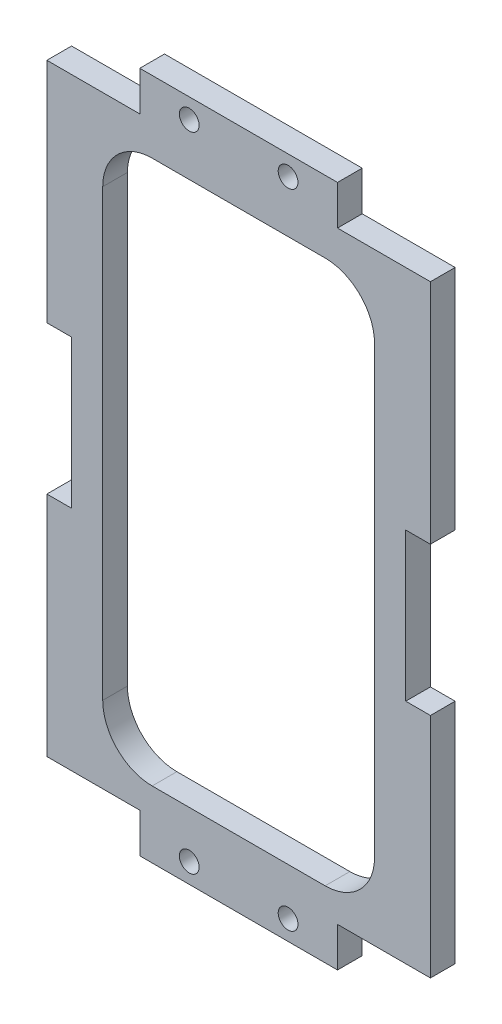
ISO-10303-21;
HEADER;
FILE_DESCRIPTION(('STEP AP214'),'2;1');
FILE_NAME('part.step','',(''),(''),'','','');
FILE_SCHEMA(('AUTOMOTIVE_DESIGN { 1 0 10303 214 1 1 1 1 }'));
ENDSEC;
DATA;
#1=APPLICATION_CONTEXT('core data for automotive mechanical design processes');
#2=APPLICATION_PROTOCOL_DEFINITION('international standard','automotive_design',2000,#1);
#3=PRODUCT_CONTEXT('',#1,'mechanical');
#4=PRODUCT('Part','Part','',(#3));
#5=PRODUCT_RELATED_PRODUCT_CATEGORY('part','',(#4));
#6=PRODUCT_DEFINITION_FORMATION('','',#4);
#7=PRODUCT_DEFINITION_CONTEXT('part definition',#1,'design');
#8=PRODUCT_DEFINITION('design','',#6,#7);
#9=PRODUCT_DEFINITION_SHAPE('','',#8);
#10=(LENGTH_UNIT() NAMED_UNIT(*) SI_UNIT(.MILLI.,.METRE.));
#11=(NAMED_UNIT(*) PLANE_ANGLE_UNIT() SI_UNIT($,.RADIAN.));
#12=(NAMED_UNIT(*) SI_UNIT($,.STERADIAN.) SOLID_ANGLE_UNIT());
#13=UNCERTAINTY_MEASURE_WITH_UNIT(LENGTH_MEASURE(1.E-05),#10,'distance_accuracy_value','');
#14=(GEOMETRIC_REPRESENTATION_CONTEXT(3) GLOBAL_UNCERTAINTY_ASSIGNED_CONTEXT((#13)) GLOBAL_UNIT_ASSIGNED_CONTEXT((#10,
#11,#12)) REPRESENTATION_CONTEXT('',''));
#15=CARTESIAN_POINT('',(0.,0.,0.));
#16=DIRECTION('',(0.,0.,1.));
#17=DIRECTION('',(1.,0.,0.));
#18=AXIS2_PLACEMENT_3D('',#15,#16,#17);
#19=CARTESIAN_POINT('',(0.,0.,5.));
#20=DIRECTION('',(1.,0.,0.));
#21=DIRECTION('',(0.,0.,-1.));
#22=AXIS2_PLACEMENT_3D('',#19,#20,#21);
#23=PLANE('',#22);
#24=DIRECTION('',(0.,0.,1.));
#25=VECTOR('',#24,1.);
#26=CARTESIAN_POINT('',(0.,7.5,0.));
#27=LINE('',#26,#25);
#28=CARTESIAN_POINT('',(0.,7.5,0.));
#29=VERTEX_POINT('',#28);
#30=CARTESIAN_POINT('',(0.,7.5,5.));
#31=VERTEX_POINT('',#30);
#32=EDGE_CURVE('E315',#29,#31,#27,.T.);
#33=ORIENTED_EDGE('',*,*,#32,.T.);
#34=DIRECTION('',(0.,-1.,0.));
#35=VECTOR('',#34,1.);
#36=CARTESIAN_POINT('',(0.,0.,5.));
#37=LINE('',#36,#35);
#38=CARTESIAN_POINT('',(0.,53.5,5.));
#39=VERTEX_POINT('',#38);
#40=EDGE_CURVE('E416',#39,#31,#37,.T.);
#41=ORIENTED_EDGE('',*,*,#40,.F.);
#42=DIRECTION('',(0.,0.,1.));
#43=VECTOR('',#42,1.);
#44=CARTESIAN_POINT('',(0.,53.5,0.));
#45=LINE('',#44,#43);
#46=CARTESIAN_POINT('',(0.,53.5,0.));
#47=VERTEX_POINT('',#46);
#48=EDGE_CURVE('E392',#47,#39,#45,.T.);
#49=ORIENTED_EDGE('',*,*,#48,.F.);
#50=DIRECTION('',(0.,-1.,0.));
#51=VECTOR('',#50,1.);
#52=CARTESIAN_POINT('',(0.,0.,0.));
#53=LINE('',#52,#51);
#54=EDGE_CURVE('E410',#47,#29,#53,.T.);
#55=ORIENTED_EDGE('',*,*,#54,.T.);
#56=EDGE_LOOP('',(#33,#41,#49,#55));
#57=FACE_BOUND('',#56,.T.);
#58=ADVANCED_FACE('F34',(#57),#23,.F.);
#59=DIRECTION('',(0.,0.,1.));
#60=VECTOR('',#59,1.);
#61=CARTESIAN_POINT('',(0.,83.5,0.));
#62=LINE('',#61,#60);
#63=CARTESIAN_POINT('',(0.,83.5,0.));
#64=VERTEX_POINT('',#63);
#65=CARTESIAN_POINT('',(0.,83.5,5.));
#66=VERTEX_POINT('',#65);
#67=EDGE_CURVE('E394',#64,#66,#62,.T.);
#68=ORIENTED_EDGE('',*,*,#67,.T.);
#69=CARTESIAN_POINT('',(0.,129.5,5.));
#70=VERTEX_POINT('',#69);
#71=EDGE_CURVE('E412',#70,#66,#37,.T.);
#72=ORIENTED_EDGE('',*,*,#71,.F.);
#73=DIRECTION('',(0.,0.,1.));
#74=VECTOR('',#73,1.);
#75=CARTESIAN_POINT('',(0.,129.5,0.));
#76=LINE('',#75,#74);
#77=CARTESIAN_POINT('',(0.,129.5,0.));
#78=VERTEX_POINT('',#77);
#79=EDGE_CURVE('E408',#78,#70,#76,.T.);
#80=ORIENTED_EDGE('',*,*,#79,.F.);
#81=EDGE_CURVE('E420',#78,#64,#53,.T.);
#82=ORIENTED_EDGE('',*,*,#81,.T.);
#83=EDGE_LOOP('',(#68,#72,#80,#82));
#84=FACE_BOUND('',#83,.T.);
#85=ADVANCED_FACE('F499',(#84),#23,.F.);
#86=CARTESIAN_POINT('',(0.,0.,5.));
#87=DIRECTION('',(0.,0.,-1.));
#88=DIRECTION('',(-1.,0.,0.));
#89=AXIS2_PLACEMENT_3D('',#86,#87,#88);
#90=PLANE('',#89);
#91=DIRECTION('',(0.,1.,0.));
#92=VECTOR('',#91,1.);
#93=CARTESIAN_POINT('',(11.3,0.,5.));
#94=LINE('',#93,#92);
#95=CARTESIAN_POINT('',(11.3,23.,5.));
#96=VERTEX_POINT('',#95);
#97=CARTESIAN_POINT('',(11.3,113.,5.));
#98=VERTEX_POINT('',#97);
#99=EDGE_CURVE('E276',#96,#98,#94,.T.);
#100=ORIENTED_EDGE('',*,*,#99,.T.);
#101=CARTESIAN_POINT('',(21.3,113.,5.));
#102=DIRECTION('',(0.,0.,-1.));
#103=DIRECTION('',(-1.,0.,0.));
#104=AXIS2_PLACEMENT_3D('',#101,#102,#103);
#105=CIRCLE('',#104,10.);
#106=CARTESIAN_POINT('',(21.3,123.,5.));
#107=VERTEX_POINT('',#106);
#108=EDGE_CURVE('E11',#98,#107,#105,.T.);
#109=ORIENTED_EDGE('',*,*,#108,.T.);
#110=DIRECTION('',(1.,0.,0.));
#111=VECTOR('',#110,1.);
#112=CARTESIAN_POINT('',(0.,123.,5.));
#113=LINE('',#112,#111);
#114=CARTESIAN_POINT('',(56.3,123.,5.));
#115=VERTEX_POINT('',#114);
#116=EDGE_CURVE('E278',#107,#115,#113,.T.);
#117=ORIENTED_EDGE('',*,*,#116,.T.);
#118=CARTESIAN_POINT('',(56.3,113.,5.));
#119=DIRECTION('',(0.,0.,-1.));
#120=DIRECTION('',(-1.,0.,0.));
#121=AXIS2_PLACEMENT_3D('',#118,#119,#120);
#122=CIRCLE('',#121,10.);
#123=CARTESIAN_POINT('',(66.3,113.,5.));
#124=VERTEX_POINT('',#123);
#125=EDGE_CURVE('E448',#115,#124,#122,.T.);
#126=ORIENTED_EDGE('',*,*,#125,.T.);
#127=DIRECTION('',(0.,-1.,0.));
#128=VECTOR('',#127,1.);
#129=CARTESIAN_POINT('',(66.3,0.,5.));
#130=LINE('',#129,#128);
#131=CARTESIAN_POINT('',(66.3,23.,5.));
#132=VERTEX_POINT('',#131);
#133=EDGE_CURVE('E281',#124,#132,#130,.T.);
#134=ORIENTED_EDGE('',*,*,#133,.T.);
#135=CARTESIAN_POINT('',(56.3,23.,5.));
#136=DIRECTION('',(0.,0.,-1.));
#137=DIRECTION('',(-1.,0.,0.));
#138=AXIS2_PLACEMENT_3D('',#135,#136,#137);
#139=CIRCLE('',#138,10.);
#140=CARTESIAN_POINT('',(56.3,13.,5.));
#141=VERTEX_POINT('',#140);
#142=EDGE_CURVE('E452',#132,#141,#139,.T.);
#143=ORIENTED_EDGE('',*,*,#142,.T.);
#144=DIRECTION('',(-1.,0.,0.));
#145=VECTOR('',#144,1.);
#146=CARTESIAN_POINT('',(0.,13.,5.));
#147=LINE('',#146,#145);
#148=CARTESIAN_POINT('',(21.3,13.,5.));
#149=VERTEX_POINT('',#148);
#150=EDGE_CURVE('E274',#141,#149,#147,.T.);
#151=ORIENTED_EDGE('',*,*,#150,.T.);
#152=CARTESIAN_POINT('',(21.3,23.,5.));
#153=DIRECTION('',(0.,0.,-1.));
#154=DIRECTION('',(-1.,0.,0.));
#155=AXIS2_PLACEMENT_3D('',#152,#153,#154);
#156=CIRCLE('',#155,10.);
#157=EDGE_CURVE('E56',#149,#96,#156,.T.);
#158=ORIENTED_EDGE('',*,*,#157,.T.);
#159=EDGE_LOOP('',(#100,#109,#117,#126,#134,#143,#151,#158));
#160=FACE_BOUND('',#159,.T.);
#161=CARTESIAN_POINT('',(48.8,133.5,5.));
#162=DIRECTION('',(0.,0.,1.));
#163=DIRECTION('',(1.,0.,0.));
#164=AXIS2_PLACEMENT_3D('',#161,#162,#163);
#165=CIRCLE('',#164,2.);
#166=CARTESIAN_POINT('',(50.8,133.5,5.));
#167=VERTEX_POINT('',#166);
#168=EDGE_CURVE('E289',#167,#167,#165,.T.);
#169=ORIENTED_EDGE('',*,*,#168,.F.);
#170=EDGE_LOOP('',(#169));
#171=FACE_BOUND('',#170,.T.);
#172=CARTESIAN_POINT('',(28.8,3.5,5.));
#173=DIRECTION('',(0.,0.,1.));
#174=DIRECTION('',(1.,0.,0.));
#175=AXIS2_PLACEMENT_3D('',#172,#173,#174);
#176=CIRCLE('',#175,2.);
#177=CARTESIAN_POINT('',(30.8,3.5,5.));
#178=VERTEX_POINT('',#177);
#179=EDGE_CURVE('E295',#178,#178,#176,.T.);
#180=ORIENTED_EDGE('',*,*,#179,.F.);
#181=EDGE_LOOP('',(#180));
#182=FACE_BOUND('',#181,.T.);
#183=CARTESIAN_POINT('',(48.8,3.5,5.));
#184=DIRECTION('',(0.,0.,1.));
#185=DIRECTION('',(1.,0.,0.));
#186=AXIS2_PLACEMENT_3D('',#183,#184,#185);
#187=CIRCLE('',#186,2.);
#188=CARTESIAN_POINT('',(50.8,3.5,5.));
#189=VERTEX_POINT('',#188);
#190=EDGE_CURVE('E284',#189,#189,#187,.T.);
#191=ORIENTED_EDGE('',*,*,#190,.F.);
#192=EDGE_LOOP('',(#191));
#193=FACE_BOUND('',#192,.T.);
#194=CARTESIAN_POINT('',(28.8,133.5,5.));
#195=DIRECTION('',(0.,0.,1.));
#196=DIRECTION('',(1.,0.,0.));
#197=AXIS2_PLACEMENT_3D('',#194,#195,#196);
#198=CIRCLE('',#197,2.);
#199=CARTESIAN_POINT('',(30.8,133.5,5.));
#200=VERTEX_POINT('',#199);
#201=EDGE_CURVE('E288',#200,#200,#198,.T.);
#202=ORIENTED_EDGE('',*,*,#201,.F.);
#203=EDGE_LOOP('',(#202));
#204=FACE_BOUND('',#203,.T.);
#205=DIRECTION('',(1.,0.,0.));
#206=VECTOR('',#205,1.);
#207=CARTESIAN_POINT('',(0.,7.5,5.));
#208=LINE('',#207,#206);
#209=CARTESIAN_POINT('',(18.8,7.5,5.));
#210=VERTEX_POINT('',#209);
#211=EDGE_CURVE('E232',#31,#210,#208,.T.);
#212=ORIENTED_EDGE('',*,*,#211,.T.);
#213=DIRECTION('',(0.,1.,0.));
#214=VECTOR('',#213,1.);
#215=CARTESIAN_POINT('',(18.8,0.,5.));
#216=LINE('',#215,#214);
#217=CARTESIAN_POINT('',(18.8,-0.5,5.));
#218=VERTEX_POINT('',#217);
#219=EDGE_CURVE('E310',#218,#210,#216,.T.);
#220=ORIENTED_EDGE('',*,*,#219,.F.);
#221=DIRECTION('',(1.,0.,0.));
#222=VECTOR('',#221,1.);
#223=CARTESIAN_POINT('',(18.8,-0.5,5.));
#224=LINE('',#223,#222);
#225=CARTESIAN_POINT('',(58.8,-0.5,5.));
#226=VERTEX_POINT('',#225);
#227=EDGE_CURVE('E240',#218,#226,#224,.T.);
#228=ORIENTED_EDGE('',*,*,#227,.T.);
#229=DIRECTION('',(0.,1.,0.));
#230=VECTOR('',#229,1.);
#231=CARTESIAN_POINT('',(58.8,0.,5.));
#232=LINE('',#231,#230);
#233=CARTESIAN_POINT('',(58.8,7.5,5.));
#234=VERTEX_POINT('',#233);
#235=EDGE_CURVE('E325',#226,#234,#232,.T.);
#236=ORIENTED_EDGE('',*,*,#235,.T.);
#237=DIRECTION('',(-1.,0.,0.));
#238=VECTOR('',#237,1.);
#239=CARTESIAN_POINT('',(0.,7.49999999999999,5.));
#240=LINE('',#239,#238);
#241=CARTESIAN_POINT('',(77.6,7.5,5.));
#242=VERTEX_POINT('',#241);
#243=EDGE_CURVE('E322',#242,#234,#240,.T.);
#244=ORIENTED_EDGE('',*,*,#243,.F.);
#245=DIRECTION('',(0.,1.,0.));
#246=VECTOR('',#245,1.);
#247=CARTESIAN_POINT('',(77.6,0.,5.));
#248=LINE('',#247,#246);
#249=CARTESIAN_POINT('',(77.6,53.5,5.));
#250=VERTEX_POINT('',#249);
#251=EDGE_CURVE('E419',#242,#250,#248,.T.);
#252=ORIENTED_EDGE('',*,*,#251,.T.);
#253=DIRECTION('',(-1.,0.,0.));
#254=VECTOR('',#253,1.);
#255=CARTESIAN_POINT('',(0.,53.5,5.));
#256=LINE('',#255,#254);
#257=CARTESIAN_POINT('',(72.6,53.5,5.));
#258=VERTEX_POINT('',#257);
#259=EDGE_CURVE('E353',#250,#258,#256,.T.);
#260=ORIENTED_EDGE('',*,*,#259,.T.);
#261=DIRECTION('',(0.,-1.,0.));
#262=VECTOR('',#261,1.);
#263=CARTESIAN_POINT('',(72.6,0.,5.));
#264=LINE('',#263,#262);
#265=CARTESIAN_POINT('',(72.6,83.5,5.));
#266=VERTEX_POINT('',#265);
#267=EDGE_CURVE('E362',#266,#258,#264,.T.);
#268=ORIENTED_EDGE('',*,*,#267,.F.);
#269=DIRECTION('',(-1.,0.,0.));
#270=VECTOR('',#269,1.);
#271=CARTESIAN_POINT('',(0.,83.5,5.));
#272=LINE('',#271,#270);
#273=CARTESIAN_POINT('',(77.6,83.5,5.));
#274=VERTEX_POINT('',#273);
#275=EDGE_CURVE('E359',#274,#266,#272,.T.);
#276=ORIENTED_EDGE('',*,*,#275,.F.);
#277=CARTESIAN_POINT('',(77.6,129.5,5.));
#278=VERTEX_POINT('',#277);
#279=EDGE_CURVE('E415',#274,#278,#248,.T.);
#280=ORIENTED_EDGE('',*,*,#279,.T.);
#281=DIRECTION('',(1.,0.,0.));
#282=VECTOR('',#281,1.);
#283=CARTESIAN_POINT('',(1.91188672458721E-13,129.5,5.));
#284=LINE('',#283,#282);
#285=CARTESIAN_POINT('',(58.8,129.5,5.));
#286=VERTEX_POINT('',#285);
#287=EDGE_CURVE('E337',#286,#278,#284,.T.);
#288=ORIENTED_EDGE('',*,*,#287,.F.);
#289=DIRECTION('',(0.,-1.,0.));
#290=VECTOR('',#289,1.);
#291=CARTESIAN_POINT('',(58.8,0.,5.));
#292=LINE('',#291,#290);
#293=CARTESIAN_POINT('',(58.8,137.5,5.));
#294=VERTEX_POINT('',#293);
#295=EDGE_CURVE('E341',#294,#286,#292,.T.);
#296=ORIENTED_EDGE('',*,*,#295,.F.);
#297=DIRECTION('',(-1.,0.,0.));
#298=VECTOR('',#297,1.);
#299=CARTESIAN_POINT('',(18.8,137.5,5.));
#300=LINE('',#299,#298);
#301=CARTESIAN_POINT('',(18.8,137.5,5.));
#302=VERTEX_POINT('',#301);
#303=EDGE_CURVE('E250',#294,#302,#300,.T.);
#304=ORIENTED_EDGE('',*,*,#303,.T.);
#305=DIRECTION('',(0.,-1.,0.));
#306=VECTOR('',#305,1.);
#307=CARTESIAN_POINT('',(18.8000000000001,0.,5.));
#308=LINE('',#307,#306);
#309=CARTESIAN_POINT('',(18.8,129.5,5.));
#310=VERTEX_POINT('',#309);
#311=EDGE_CURVE('E401',#302,#310,#308,.T.);
#312=ORIENTED_EDGE('',*,*,#311,.T.);
#313=DIRECTION('',(-1.,0.,0.));
#314=VECTOR('',#313,1.);
#315=CARTESIAN_POINT('',(0.,129.5,5.));
#316=LINE('',#315,#314);
#317=EDGE_CURVE('E318',#310,#70,#316,.T.);
#318=ORIENTED_EDGE('',*,*,#317,.T.);
#319=ORIENTED_EDGE('',*,*,#71,.T.);
#320=DIRECTION('',(1.,0.,0.));
#321=VECTOR('',#320,1.);
#322=CARTESIAN_POINT('',(0.,83.5,5.));
#323=LINE('',#322,#321);
#324=CARTESIAN_POINT('',(5.,83.5,5.));
#325=VERTEX_POINT('',#324);
#326=EDGE_CURVE('E386',#66,#325,#323,.T.);
#327=ORIENTED_EDGE('',*,*,#326,.T.);
#328=DIRECTION('',(0.,-1.,0.));
#329=VECTOR('',#328,1.);
#330=CARTESIAN_POINT('',(5.00000000000001,0.,5.));
#331=LINE('',#330,#329);
#332=CARTESIAN_POINT('',(5.,53.5,5.));
#333=VERTEX_POINT('',#332);
#334=EDGE_CURVE('E306',#325,#333,#331,.T.);
#335=ORIENTED_EDGE('',*,*,#334,.T.);
#336=DIRECTION('',(1.,0.,0.));
#337=VECTOR('',#336,1.);
#338=CARTESIAN_POINT('',(0.,53.5,5.));
#339=LINE('',#338,#337);
#340=EDGE_CURVE('E378',#39,#333,#339,.T.);
#341=ORIENTED_EDGE('',*,*,#340,.F.);
#342=ORIENTED_EDGE('',*,*,#40,.T.);
#343=EDGE_LOOP('',(#212,#220,#228,#236,#244,#252,#260,#268,#276,#280,#288,#296,#304,#312,#318,
#319,#327,#335,#341,#342));
#344=FACE_BOUND('',#343,.T.);
#345=ADVANCED_FACE('F467',(#160,#171,#182,#193,#204,#344),#90,.F.);
#346=CARTESIAN_POINT('',(0.,0.,0.));
#347=DIRECTION('',(0.,0.,-1.));
#348=DIRECTION('',(-1.,0.,0.));
#349=AXIS2_PLACEMENT_3D('',#346,#347,#348);
#350=PLANE('',#349);
#351=DIRECTION('',(0.,-1.,0.));
#352=VECTOR('',#351,1.);
#353=CARTESIAN_POINT('',(66.3,123.,0.));
#354=LINE('',#353,#352);
#355=CARTESIAN_POINT('',(66.3,113.,0.));
#356=VERTEX_POINT('',#355);
#357=CARTESIAN_POINT('',(66.3,23.,0.));
#358=VERTEX_POINT('',#357);
#359=EDGE_CURVE('E261',#356,#358,#354,.T.);
#360=ORIENTED_EDGE('',*,*,#359,.F.);
#361=CARTESIAN_POINT('',(56.3,113.,0.));
#362=DIRECTION('',(0.,0.,-1.));
#363=DIRECTION('',(-1.,0.,0.));
#364=AXIS2_PLACEMENT_3D('',#361,#362,#363);
#365=CIRCLE('',#364,10.);
#366=CARTESIAN_POINT('',(56.3,123.,0.));
#367=VERTEX_POINT('',#366);
#368=EDGE_CURVE('E446',#356,#367,#365,.F.);
#369=ORIENTED_EDGE('',*,*,#368,.T.);
#370=DIRECTION('',(1.,0.,0.));
#371=VECTOR('',#370,1.);
#372=CARTESIAN_POINT('',(66.3,123.,0.));
#373=LINE('',#372,#371);
#374=CARTESIAN_POINT('',(21.3,123.,0.));
#375=VERTEX_POINT('',#374);
#376=EDGE_CURVE('E271',#375,#367,#373,.T.);
#377=ORIENTED_EDGE('',*,*,#376,.F.);
#378=CARTESIAN_POINT('',(21.3,113.,0.));
#379=DIRECTION('',(0.,0.,-1.));
#380=DIRECTION('',(-1.,0.,0.));
#381=AXIS2_PLACEMENT_3D('',#378,#379,#380);
#382=CIRCLE('',#381,10.);
#383=CARTESIAN_POINT('',(11.3,113.,0.));
#384=VERTEX_POINT('',#383);
#385=EDGE_CURVE('E42',#375,#384,#382,.F.);
#386=ORIENTED_EDGE('',*,*,#385,.T.);
#387=DIRECTION('',(0.,1.,0.));
#388=VECTOR('',#387,1.);
#389=CARTESIAN_POINT('',(11.3,123.,0.));
#390=LINE('',#389,#388);
#391=CARTESIAN_POINT('',(11.3,23.,0.));
#392=VERTEX_POINT('',#391);
#393=EDGE_CURVE('E269',#392,#384,#390,.T.);
#394=ORIENTED_EDGE('',*,*,#393,.F.);
#395=CARTESIAN_POINT('',(21.3,23.,0.));
#396=DIRECTION('',(0.,0.,-1.));
#397=DIRECTION('',(-1.,0.,0.));
#398=AXIS2_PLACEMENT_3D('',#395,#396,#397);
#399=CIRCLE('',#398,10.);
#400=CARTESIAN_POINT('',(21.3,13.,0.));
#401=VERTEX_POINT('',#400);
#402=EDGE_CURVE('E454',#392,#401,#399,.F.);
#403=ORIENTED_EDGE('',*,*,#402,.T.);
#404=DIRECTION('',(-1.,0.,0.));
#405=VECTOR('',#404,1.);
#406=CARTESIAN_POINT('',(66.3,13.,0.));
#407=LINE('',#406,#405);
#408=CARTESIAN_POINT('',(56.3,13.,0.));
#409=VERTEX_POINT('',#408);
#410=EDGE_CURVE('E266',#409,#401,#407,.T.);
#411=ORIENTED_EDGE('',*,*,#410,.F.);
#412=CARTESIAN_POINT('',(56.3,23.,0.));
#413=DIRECTION('',(0.,0.,-1.));
#414=DIRECTION('',(-1.,0.,0.));
#415=AXIS2_PLACEMENT_3D('',#412,#413,#414);
#416=CIRCLE('',#415,10.);
#417=EDGE_CURVE('E450',#409,#358,#416,.F.);
#418=ORIENTED_EDGE('',*,*,#417,.T.);
#419=EDGE_LOOP('',(#360,#369,#377,#386,#394,#403,#411,#418));
#420=FACE_BOUND('',#419,.T.);
#421=CARTESIAN_POINT('',(48.8,133.5,0.));
#422=DIRECTION('',(0.,0.,1.));
#423=DIRECTION('',(1.,0.,0.));
#424=AXIS2_PLACEMENT_3D('',#421,#422,#423);
#425=CIRCLE('',#424,2.);
#426=CARTESIAN_POINT('',(50.8,133.5,0.));
#427=VERTEX_POINT('',#426);
#428=EDGE_CURVE('E285',#427,#427,#425,.T.);
#429=ORIENTED_EDGE('',*,*,#428,.T.);
#430=EDGE_LOOP('',(#429));
#431=FACE_BOUND('',#430,.T.);
#432=CARTESIAN_POINT('',(28.8,3.5,0.));
#433=DIRECTION('',(0.,0.,1.));
#434=DIRECTION('',(1.,0.,0.));
#435=AXIS2_PLACEMENT_3D('',#432,#433,#434);
#436=CIRCLE('',#435,2.);
#437=CARTESIAN_POINT('',(30.8,3.5,0.));
#438=VERTEX_POINT('',#437);
#439=EDGE_CURVE('E292',#438,#438,#436,.T.);
#440=ORIENTED_EDGE('',*,*,#439,.T.);
#441=EDGE_LOOP('',(#440));
#442=FACE_BOUND('',#441,.T.);
#443=CARTESIAN_POINT('',(48.8,3.5,0.));
#444=DIRECTION('',(0.,0.,1.));
#445=DIRECTION('',(1.,0.,0.));
#446=AXIS2_PLACEMENT_3D('',#443,#444,#445);
#447=CIRCLE('',#446,2.);
#448=CARTESIAN_POINT('',(50.8,3.5,0.));
#449=VERTEX_POINT('',#448);
#450=EDGE_CURVE('E298',#449,#449,#447,.T.);
#451=ORIENTED_EDGE('',*,*,#450,.T.);
#452=EDGE_LOOP('',(#451));
#453=FACE_BOUND('',#452,.T.);
#454=CARTESIAN_POINT('',(28.8,133.5,0.));
#455=DIRECTION('',(0.,0.,1.));
#456=DIRECTION('',(1.,0.,0.));
#457=AXIS2_PLACEMENT_3D('',#454,#455,#456);
#458=CIRCLE('',#457,2.);
#459=CARTESIAN_POINT('',(30.8,133.5,0.));
#460=VERTEX_POINT('',#459);
#461=EDGE_CURVE('E303',#460,#460,#458,.T.);
#462=ORIENTED_EDGE('',*,*,#461,.T.);
#463=EDGE_LOOP('',(#462));
#464=FACE_BOUND('',#463,.T.);
#465=DIRECTION('',(0.,1.,0.));
#466=VECTOR('',#465,1.);
#467=CARTESIAN_POINT('',(18.8,0.,0.));
#468=LINE('',#467,#466);
#469=CARTESIAN_POINT('',(18.8,-0.5,0.));
#470=VERTEX_POINT('',#469);
#471=CARTESIAN_POINT('',(18.8,7.5,0.));
#472=VERTEX_POINT('',#471);
#473=EDGE_CURVE('E221',#470,#472,#468,.T.);
#474=ORIENTED_EDGE('',*,*,#473,.T.);
#475=DIRECTION('',(1.,0.,0.));
#476=VECTOR('',#475,1.);
#477=CARTESIAN_POINT('',(0.,7.5,0.));
#478=LINE('',#477,#476);
#479=EDGE_CURVE('E231',#29,#472,#478,.T.);
#480=ORIENTED_EDGE('',*,*,#479,.F.);
#481=ORIENTED_EDGE('',*,*,#54,.F.);
#482=DIRECTION('',(1.,0.,0.));
#483=VECTOR('',#482,1.);
#484=CARTESIAN_POINT('',(0.,53.5,0.));
#485=LINE('',#484,#483);
#486=CARTESIAN_POINT('',(5.,53.5,0.));
#487=VERTEX_POINT('',#486);
#488=EDGE_CURVE('E380',#47,#487,#485,.T.);
#489=ORIENTED_EDGE('',*,*,#488,.T.);
#490=DIRECTION('',(0.,-1.,0.));
#491=VECTOR('',#490,1.);
#492=CARTESIAN_POINT('',(5.00000000000001,0.,0.));
#493=LINE('',#492,#491);
#494=CARTESIAN_POINT('',(5.,83.5,0.));
#495=VERTEX_POINT('',#494);
#496=EDGE_CURVE('E375',#495,#487,#493,.T.);
#497=ORIENTED_EDGE('',*,*,#496,.F.);
#498=DIRECTION('',(1.,0.,0.));
#499=VECTOR('',#498,1.);
#500=CARTESIAN_POINT('',(0.,83.5,0.));
#501=LINE('',#500,#499);
#502=EDGE_CURVE('E377',#64,#495,#501,.T.);
#503=ORIENTED_EDGE('',*,*,#502,.F.);
#504=ORIENTED_EDGE('',*,*,#81,.F.);
#505=DIRECTION('',(-1.,0.,0.));
#506=VECTOR('',#505,1.);
#507=CARTESIAN_POINT('',(0.,129.5,0.));
#508=LINE('',#507,#506);
#509=CARTESIAN_POINT('',(18.8,129.5,0.));
#510=VERTEX_POINT('',#509);
#511=EDGE_CURVE('E398',#510,#78,#508,.T.);
#512=ORIENTED_EDGE('',*,*,#511,.F.);
#513=DIRECTION('',(0.,-1.,0.));
#514=VECTOR('',#513,1.);
#515=CARTESIAN_POINT('',(18.8000000000001,0.,0.));
#516=LINE('',#515,#514);
#517=CARTESIAN_POINT('',(18.8,137.5,0.));
#518=VERTEX_POINT('',#517);
#519=EDGE_CURVE('E400',#518,#510,#516,.T.);
#520=ORIENTED_EDGE('',*,*,#519,.F.);
#521=DIRECTION('',(-1.,0.,0.));
#522=VECTOR('',#521,1.);
#523=CARTESIAN_POINT('',(18.8,137.5,0.));
#524=LINE('',#523,#522);
#525=CARTESIAN_POINT('',(58.8,137.5,0.));
#526=VERTEX_POINT('',#525);
#527=EDGE_CURVE('E252',#526,#518,#524,.T.);
#528=ORIENTED_EDGE('',*,*,#527,.F.);
#529=DIRECTION('',(0.,-1.,0.));
#530=VECTOR('',#529,1.);
#531=CARTESIAN_POINT('',(58.8,0.,0.));
#532=LINE('',#531,#530);
#533=CARTESIAN_POINT('',(58.8,129.5,0.));
#534=VERTEX_POINT('',#533);
#535=EDGE_CURVE('E333',#526,#534,#532,.T.);
#536=ORIENTED_EDGE('',*,*,#535,.T.);
#537=DIRECTION('',(1.,0.,0.));
#538=VECTOR('',#537,1.);
#539=CARTESIAN_POINT('',(1.91188672458721E-13,129.5,0.));
#540=LINE('',#539,#538);
#541=CARTESIAN_POINT('',(77.6,129.5,0.));
#542=VERTEX_POINT('',#541);
#543=EDGE_CURVE('E336',#534,#542,#540,.T.);
#544=ORIENTED_EDGE('',*,*,#543,.T.);
#545=DIRECTION('',(0.,1.,0.));
#546=VECTOR('',#545,1.);
#547=CARTESIAN_POINT('',(77.6,0.,0.));
#548=LINE('',#547,#546);
#549=CARTESIAN_POINT('',(77.6,83.5,0.));
#550=VERTEX_POINT('',#549);
#551=EDGE_CURVE('E423',#550,#542,#548,.T.);
#552=ORIENTED_EDGE('',*,*,#551,.F.);
#553=DIRECTION('',(-1.,0.,0.));
#554=VECTOR('',#553,1.);
#555=CARTESIAN_POINT('',(0.,83.5,0.));
#556=LINE('',#555,#554);
#557=CARTESIAN_POINT('',(72.6,83.5,0.));
#558=VERTEX_POINT('',#557);
#559=EDGE_CURVE('E349',#550,#558,#556,.T.);
#560=ORIENTED_EDGE('',*,*,#559,.T.);
#561=DIRECTION('',(0.,-1.,0.));
#562=VECTOR('',#561,1.);
#563=CARTESIAN_POINT('',(72.6,0.,0.));
#564=LINE('',#563,#562);
#565=CARTESIAN_POINT('',(72.6,53.5,0.));
#566=VERTEX_POINT('',#565);
#567=EDGE_CURVE('E352',#558,#566,#564,.T.);
#568=ORIENTED_EDGE('',*,*,#567,.T.);
#569=DIRECTION('',(-1.,0.,0.));
#570=VECTOR('',#569,1.);
#571=CARTESIAN_POINT('',(0.,53.5,0.));
#572=LINE('',#571,#570);
#573=CARTESIAN_POINT('',(77.6,53.5,0.));
#574=VERTEX_POINT('',#573);
#575=EDGE_CURVE('E356',#574,#566,#572,.T.);
#576=ORIENTED_EDGE('',*,*,#575,.F.);
#577=CARTESIAN_POINT('',(77.6,7.5,0.));
#578=VERTEX_POINT('',#577);
#579=EDGE_CURVE('E426',#578,#574,#548,.T.);
#580=ORIENTED_EDGE('',*,*,#579,.F.);
#581=DIRECTION('',(-1.,0.,0.));
#582=VECTOR('',#581,1.);
#583=CARTESIAN_POINT('',(0.,7.49999999999999,0.));
#584=LINE('',#583,#582);
#585=CARTESIAN_POINT('',(58.8,7.5,0.));
#586=VERTEX_POINT('',#585);
#587=EDGE_CURVE('E321',#578,#586,#584,.T.);
#588=ORIENTED_EDGE('',*,*,#587,.T.);
#589=DIRECTION('',(0.,1.,0.));
#590=VECTOR('',#589,1.);
#591=CARTESIAN_POINT('',(58.8,0.,0.));
#592=LINE('',#591,#590);
#593=CARTESIAN_POINT('',(58.8,-0.5,0.));
#594=VERTEX_POINT('',#593);
#595=EDGE_CURVE('E245',#594,#586,#592,.T.);
#596=ORIENTED_EDGE('',*,*,#595,.F.);
#597=DIRECTION('',(1.,0.,0.));
#598=VECTOR('',#597,1.);
#599=CARTESIAN_POINT('',(18.8,-0.5,0.));
#600=LINE('',#599,#598);
#601=EDGE_CURVE('E238',#470,#594,#600,.T.);
#602=ORIENTED_EDGE('',*,*,#601,.F.);
#603=EDGE_LOOP('',(#474,#480,#481,#489,#497,#503,#504,#512,#520,#528,#536,#544,#552,#560,#568,
#576,#580,#588,#596,#602));
#604=FACE_BOUND('',#603,.T.);
#605=ADVANCED_FACE('F243',(#420,#431,#442,#453,#464,#604),#350,.T.);
#606=CARTESIAN_POINT('',(77.6,0.,5.));
#607=DIRECTION('',(-1.,0.,0.));
#608=DIRECTION('',(0.,0.,1.));
#609=AXIS2_PLACEMENT_3D('',#606,#607,#608);
#610=PLANE('',#609);
#611=ORIENTED_EDGE('',*,*,#251,.F.);
#612=DIRECTION('',(0.,0.,1.));
#613=VECTOR('',#612,1.);
#614=CARTESIAN_POINT('',(77.6,7.5,0.));
#615=LINE('',#614,#613);
#616=EDGE_CURVE('E324',#578,#242,#615,.T.);
#617=ORIENTED_EDGE('',*,*,#616,.F.);
#618=ORIENTED_EDGE('',*,*,#579,.T.);
#619=DIRECTION('',(0.,0.,1.));
#620=VECTOR('',#619,1.);
#621=CARTESIAN_POINT('',(77.6,53.5,0.));
#622=LINE('',#621,#620);
#623=EDGE_CURVE('E369',#574,#250,#622,.T.);
#624=ORIENTED_EDGE('',*,*,#623,.T.);
#625=EDGE_LOOP('',(#611,#617,#618,#624));
#626=FACE_BOUND('',#625,.T.);
#627=ADVANCED_FACE('F595',(#626),#610,.F.);
#628=ORIENTED_EDGE('',*,*,#551,.T.);
#629=DIRECTION('',(0.,0.,1.));
#630=VECTOR('',#629,1.);
#631=CARTESIAN_POINT('',(77.6,129.5,0.));
#632=LINE('',#631,#630);
#633=EDGE_CURVE('E328',#542,#278,#632,.T.);
#634=ORIENTED_EDGE('',*,*,#633,.T.);
#635=ORIENTED_EDGE('',*,*,#279,.F.);
#636=DIRECTION('',(0.,0.,1.));
#637=VECTOR('',#636,1.);
#638=CARTESIAN_POINT('',(77.6,83.5,0.));
#639=LINE('',#638,#637);
#640=EDGE_CURVE('E344',#550,#274,#639,.T.);
#641=ORIENTED_EDGE('',*,*,#640,.F.);
#642=EDGE_LOOP('',(#628,#634,#635,#641));
#643=FACE_BOUND('',#642,.T.);
#644=ADVANCED_FACE('F508',(#643),#610,.F.);
#645=CARTESIAN_POINT('',(0.,129.5,0.));
#646=DIRECTION('',(0.,1.,0.));
#647=DIRECTION('',(0.,0.,1.));
#648=AXIS2_PLACEMENT_3D('',#645,#646,#647);
#649=PLANE('',#648);
#650=ORIENTED_EDGE('',*,*,#317,.F.);
#651=DIRECTION('',(0.,0.,1.));
#652=VECTOR('',#651,1.);
#653=CARTESIAN_POINT('',(18.8,129.5,0.));
#654=LINE('',#653,#652);
#655=EDGE_CURVE('E403',#510,#310,#654,.T.);
#656=ORIENTED_EDGE('',*,*,#655,.F.);
#657=ORIENTED_EDGE('',*,*,#511,.T.);
#658=ORIENTED_EDGE('',*,*,#79,.T.);
#659=EDGE_LOOP('',(#650,#656,#657,#658));
#660=FACE_BOUND('',#659,.T.);
#661=ADVANCED_FACE('F588',(#660),#649,.T.);
#662=CARTESIAN_POINT('',(18.8000000000001,0.,0.));
#663=DIRECTION('',(-1.,0.,0.));
#664=DIRECTION('',(0.,-1.,0.));
#665=AXIS2_PLACEMENT_3D('',#662,#663,#664);
#666=PLANE('',#665);
#667=ORIENTED_EDGE('',*,*,#311,.F.);
#668=DIRECTION('',(0.,0.,1.));
#669=VECTOR('',#668,1.);
#670=CARTESIAN_POINT('',(18.8,137.5,0.));
#671=LINE('',#670,#669);
#672=EDGE_CURVE('E258',#518,#302,#671,.T.);
#673=ORIENTED_EDGE('',*,*,#672,.F.);
#674=ORIENTED_EDGE('',*,*,#519,.T.);
#675=ORIENTED_EDGE('',*,*,#655,.T.);
#676=EDGE_LOOP('',(#667,#673,#674,#675));
#677=FACE_BOUND('',#676,.T.);
#678=ADVANCED_FACE('F574',(#677),#666,.T.);
#679=CARTESIAN_POINT('',(0.,83.5,0.));
#680=DIRECTION('',(0.,1.,0.));
#681=DIRECTION('',(0.,0.,1.));
#682=AXIS2_PLACEMENT_3D('',#679,#680,#681);
#683=PLANE('',#682);
#684=ORIENTED_EDGE('',*,*,#275,.T.);
#685=DIRECTION('',(0.,0.,1.));
#686=VECTOR('',#685,1.);
#687=CARTESIAN_POINT('',(72.6,83.5,0.));
#688=LINE('',#687,#686);
#689=EDGE_CURVE('E358',#558,#266,#688,.T.);
#690=ORIENTED_EDGE('',*,*,#689,.F.);
#691=ORIENTED_EDGE('',*,*,#559,.F.);
#692=ORIENTED_EDGE('',*,*,#640,.T.);
#693=EDGE_LOOP('',(#684,#690,#691,#692));
#694=FACE_BOUND('',#693,.T.);
#695=ADVANCED_FACE('F567',(#694),#683,.F.);
#696=CARTESIAN_POINT('',(0.,53.5,0.));
#697=DIRECTION('',(0.,1.,0.));
#698=DIRECTION('',(0.,0.,1.));
#699=AXIS2_PLACEMENT_3D('',#696,#697,#698);
#700=PLANE('',#699);
#701=ORIENTED_EDGE('',*,*,#259,.F.);
#702=ORIENTED_EDGE('',*,*,#623,.F.);
#703=ORIENTED_EDGE('',*,*,#575,.T.);
#704=DIRECTION('',(0.,0.,1.));
#705=VECTOR('',#704,1.);
#706=CARTESIAN_POINT('',(72.6,53.5,0.));
#707=LINE('',#706,#705);
#708=EDGE_CURVE('E372',#566,#258,#707,.T.);
#709=ORIENTED_EDGE('',*,*,#708,.T.);
#710=EDGE_LOOP('',(#701,#702,#703,#709));
#711=FACE_BOUND('',#710,.T.);
#712=ADVANCED_FACE('F564',(#711),#700,.T.);
#713=CARTESIAN_POINT('',(72.6,0.,0.));
#714=DIRECTION('',(-1.,0.,0.));
#715=DIRECTION('',(0.,-1.,0.));
#716=AXIS2_PLACEMENT_3D('',#713,#714,#715);
#717=PLANE('',#716);
#718=ORIENTED_EDGE('',*,*,#267,.T.);
#719=ORIENTED_EDGE('',*,*,#708,.F.);
#720=ORIENTED_EDGE('',*,*,#567,.F.);
#721=ORIENTED_EDGE('',*,*,#689,.T.);
#722=EDGE_LOOP('',(#718,#719,#720,#721));
#723=FACE_BOUND('',#722,.T.);
#724=ADVANCED_FACE('F562',(#723),#717,.F.);
#725=CARTESIAN_POINT('',(58.8,0.,0.));
#726=DIRECTION('',(-1.,0.,0.));
#727=DIRECTION('',(0.,0.,1.));
#728=AXIS2_PLACEMENT_3D('',#725,#726,#727);
#729=PLANE('',#728);
#730=ORIENTED_EDGE('',*,*,#295,.T.);
#731=DIRECTION('',(0.,0.,1.));
#732=VECTOR('',#731,1.);
#733=CARTESIAN_POINT('',(58.8,129.5,0.));
#734=LINE('',#733,#732);
#735=EDGE_CURVE('E340',#534,#286,#734,.T.);
#736=ORIENTED_EDGE('',*,*,#735,.F.);
#737=ORIENTED_EDGE('',*,*,#535,.F.);
#738=DIRECTION('',(0.,0.,1.));
#739=VECTOR('',#738,1.);
#740=CARTESIAN_POINT('',(58.8,137.5,0.));
#741=LINE('',#740,#739);
#742=EDGE_CURVE('E255',#526,#294,#741,.T.);
#743=ORIENTED_EDGE('',*,*,#742,.T.);
#744=EDGE_LOOP('',(#730,#736,#737,#743));
#745=FACE_BOUND('',#744,.T.);
#746=ADVANCED_FACE('F558',(#745),#729,.F.);
#747=CARTESIAN_POINT('',(1.91188672458721E-13,129.5,0.));
#748=DIRECTION('',(0.,-1.,0.));
#749=DIRECTION('',(1.,0.,0.));
#750=AXIS2_PLACEMENT_3D('',#747,#748,#749);
#751=PLANE('',#750);
#752=ORIENTED_EDGE('',*,*,#287,.T.);
#753=ORIENTED_EDGE('',*,*,#633,.F.);
#754=ORIENTED_EDGE('',*,*,#543,.F.);
#755=ORIENTED_EDGE('',*,*,#735,.T.);
#756=EDGE_LOOP('',(#752,#753,#754,#755));
#757=FACE_BOUND('',#756,.T.);
#758=ADVANCED_FACE('F554',(#757),#751,.F.);
#759=CARTESIAN_POINT('',(58.8,0.,0.));
#760=DIRECTION('',(1.,0.,0.));
#761=DIRECTION('',(0.,0.,-1.));
#762=AXIS2_PLACEMENT_3D('',#759,#760,#761);
#763=PLANE('',#762);
#764=ORIENTED_EDGE('',*,*,#235,.F.);
#765=DIRECTION('',(0.,0.,1.));
#766=VECTOR('',#765,1.);
#767=CARTESIAN_POINT('',(58.8,-0.5,0.));
#768=LINE('',#767,#766);
#769=EDGE_CURVE('E241',#594,#226,#768,.T.);
#770=ORIENTED_EDGE('',*,*,#769,.F.);
#771=ORIENTED_EDGE('',*,*,#595,.T.);
#772=DIRECTION('',(0.,0.,1.));
#773=VECTOR('',#772,1.);
#774=CARTESIAN_POINT('',(58.8,7.5,0.));
#775=LINE('',#774,#773);
#776=EDGE_CURVE('E312',#586,#234,#775,.T.);
#777=ORIENTED_EDGE('',*,*,#776,.T.);
#778=EDGE_LOOP('',(#764,#770,#771,#777));
#779=FACE_BOUND('',#778,.T.);
#780=ADVANCED_FACE('F550',(#779),#763,.T.);
#781=CARTESIAN_POINT('',(0.,7.49999999999999,0.));
#782=DIRECTION('',(0.,1.,0.));
#783=DIRECTION('',(-1.,0.,0.));
#784=AXIS2_PLACEMENT_3D('',#781,#782,#783);
#785=PLANE('',#784);
#786=ORIENTED_EDGE('',*,*,#243,.T.);
#787=ORIENTED_EDGE('',*,*,#776,.F.);
#788=ORIENTED_EDGE('',*,*,#587,.F.);
#789=ORIENTED_EDGE('',*,*,#616,.T.);
#790=EDGE_LOOP('',(#786,#787,#788,#789));
#791=FACE_BOUND('',#790,.T.);
#792=ADVANCED_FACE('F543',(#791),#785,.F.);
#793=CARTESIAN_POINT('',(0.,7.5,0.));
#794=DIRECTION('',(0.,-1.,0.));
#795=DIRECTION('',(0.,0.,-1.));
#796=AXIS2_PLACEMENT_3D('',#793,#794,#795);
#797=PLANE('',#796);
#798=ORIENTED_EDGE('',*,*,#211,.F.);
#799=ORIENTED_EDGE('',*,*,#32,.F.);
#800=ORIENTED_EDGE('',*,*,#479,.T.);
#801=DIRECTION('',(0.,0.,1.));
#802=VECTOR('',#801,1.);
#803=CARTESIAN_POINT('',(18.8,7.5,0.));
#804=LINE('',#803,#802);
#805=EDGE_CURVE('E227',#472,#210,#804,.T.);
#806=ORIENTED_EDGE('',*,*,#805,.T.);
#807=EDGE_LOOP('',(#798,#799,#800,#806));
#808=FACE_BOUND('',#807,.T.);
#809=ADVANCED_FACE('F540',(#808),#797,.T.);
#810=CARTESIAN_POINT('',(18.8,0.,0.));
#811=DIRECTION('',(1.,0.,0.));
#812=DIRECTION('',(0.,0.,-1.));
#813=AXIS2_PLACEMENT_3D('',#810,#811,#812);
#814=PLANE('',#813);
#815=ORIENTED_EDGE('',*,*,#219,.T.);
#816=ORIENTED_EDGE('',*,*,#805,.F.);
#817=ORIENTED_EDGE('',*,*,#473,.F.);
#818=DIRECTION('',(0.,0.,1.));
#819=VECTOR('',#818,1.);
#820=CARTESIAN_POINT('',(18.8,-0.5,0.));
#821=LINE('',#820,#819);
#822=EDGE_CURVE('E225',#470,#218,#821,.T.);
#823=ORIENTED_EDGE('',*,*,#822,.T.);
#824=EDGE_LOOP('',(#815,#816,#817,#823));
#825=FACE_BOUND('',#824,.T.);
#826=ADVANCED_FACE('F224',(#825),#814,.F.);
#827=CARTESIAN_POINT('',(5.00000000000001,0.,0.));
#828=DIRECTION('',(-1.,0.,0.));
#829=DIRECTION('',(0.,-1.,0.));
#830=AXIS2_PLACEMENT_3D('',#827,#828,#829);
#831=PLANE('',#830);
#832=ORIENTED_EDGE('',*,*,#334,.F.);
#833=DIRECTION('',(0.,0.,1.));
#834=VECTOR('',#833,1.);
#835=CARTESIAN_POINT('',(5.,83.5,0.));
#836=LINE('',#835,#834);
#837=EDGE_CURVE('E383',#495,#325,#836,.T.);
#838=ORIENTED_EDGE('',*,*,#837,.F.);
#839=ORIENTED_EDGE('',*,*,#496,.T.);
#840=DIRECTION('',(0.,0.,1.));
#841=VECTOR('',#840,1.);
#842=CARTESIAN_POINT('',(5.,53.5,0.));
#843=LINE('',#842,#841);
#844=EDGE_CURVE('E363',#487,#333,#843,.T.);
#845=ORIENTED_EDGE('',*,*,#844,.T.);
#846=EDGE_LOOP('',(#832,#838,#839,#845));
#847=FACE_BOUND('',#846,.T.);
#848=ADVANCED_FACE('F547',(#847),#831,.T.);
#849=CARTESIAN_POINT('',(0.,53.5,0.));
#850=DIRECTION('',(0.,-1.,0.));
#851=DIRECTION('',(0.,0.,-1.));
#852=AXIS2_PLACEMENT_3D('',#849,#850,#851);
#853=PLANE('',#852);
#854=ORIENTED_EDGE('',*,*,#340,.T.);
#855=ORIENTED_EDGE('',*,*,#844,.F.);
#856=ORIENTED_EDGE('',*,*,#488,.F.);
#857=ORIENTED_EDGE('',*,*,#48,.T.);
#858=EDGE_LOOP('',(#854,#855,#856,#857));
#859=FACE_BOUND('',#858,.T.);
#860=ADVANCED_FACE('F576',(#859),#853,.F.);
#861=CARTESIAN_POINT('',(0.,83.5,0.));
#862=DIRECTION('',(0.,-1.,0.));
#863=DIRECTION('',(0.,0.,-1.));
#864=AXIS2_PLACEMENT_3D('',#861,#862,#863);
#865=PLANE('',#864);
#866=ORIENTED_EDGE('',*,*,#326,.F.);
#867=ORIENTED_EDGE('',*,*,#67,.F.);
#868=ORIENTED_EDGE('',*,*,#502,.T.);
#869=ORIENTED_EDGE('',*,*,#837,.T.);
#870=EDGE_LOOP('',(#866,#867,#868,#869));
#871=FACE_BOUND('',#870,.T.);
#872=ADVANCED_FACE('F538',(#871),#865,.T.);
#873=CARTESIAN_POINT('',(28.8,133.5,0.));
#874=DIRECTION('',(0.,0.,1.));
#875=DIRECTION('',(1.,0.,0.));
#876=AXIS2_PLACEMENT_3D('',#873,#874,#875);
#877=CYLINDRICAL_SURFACE('',#876,2.);
#878=ORIENTED_EDGE('',*,*,#461,.F.);
#879=EDGE_LOOP('',(#878));
#880=FACE_BOUND('',#879,.T.);
#881=ORIENTED_EDGE('',*,*,#201,.T.);
#882=EDGE_LOOP('',(#881));
#883=FACE_BOUND('',#882,.T.);
#884=ADVANCED_FACE('F534',(#880,#883),#877,.F.);
#885=CARTESIAN_POINT('',(48.8,3.5,0.));
#886=DIRECTION('',(0.,0.,1.));
#887=DIRECTION('',(1.,0.,0.));
#888=AXIS2_PLACEMENT_3D('',#885,#886,#887);
#889=CYLINDRICAL_SURFACE('',#888,2.);
#890=ORIENTED_EDGE('',*,*,#450,.F.);
#891=EDGE_LOOP('',(#890));
#892=FACE_BOUND('',#891,.T.);
#893=ORIENTED_EDGE('',*,*,#190,.T.);
#894=EDGE_LOOP('',(#893));
#895=FACE_BOUND('',#894,.T.);
#896=ADVANCED_FACE('F530',(#892,#895),#889,.F.);
#897=CARTESIAN_POINT('',(28.8,3.5,0.));
#898=DIRECTION('',(0.,0.,1.));
#899=DIRECTION('',(1.,0.,0.));
#900=AXIS2_PLACEMENT_3D('',#897,#898,#899);
#901=CYLINDRICAL_SURFACE('',#900,2.);
#902=ORIENTED_EDGE('',*,*,#439,.F.);
#903=EDGE_LOOP('',(#902));
#904=FACE_BOUND('',#903,.T.);
#905=ORIENTED_EDGE('',*,*,#179,.T.);
#906=EDGE_LOOP('',(#905));
#907=FACE_BOUND('',#906,.T.);
#908=ADVANCED_FACE('F526',(#904,#907),#901,.F.);
#909=CARTESIAN_POINT('',(48.8,133.5,0.));
#910=DIRECTION('',(0.,0.,1.));
#911=DIRECTION('',(1.,0.,0.));
#912=AXIS2_PLACEMENT_3D('',#909,#910,#911);
#913=CYLINDRICAL_SURFACE('',#912,2.);
#914=ORIENTED_EDGE('',*,*,#428,.F.);
#915=EDGE_LOOP('',(#914));
#916=FACE_BOUND('',#915,.T.);
#917=ORIENTED_EDGE('',*,*,#168,.T.);
#918=EDGE_LOOP('',(#917));
#919=FACE_BOUND('',#918,.T.);
#920=ADVANCED_FACE('F523',(#916,#919),#913,.F.);
#921=CARTESIAN_POINT('',(66.3,123.,7.));
#922=DIRECTION('',(1.,0.,0.));
#923=DIRECTION('',(0.,1.,0.));
#924=AXIS2_PLACEMENT_3D('',#921,#922,#923);
#925=PLANE('',#924);
#926=ORIENTED_EDGE('',*,*,#133,.F.);
#927=DIRECTION('',(0.,0.,-1.));
#928=VECTOR('',#927,1.);
#929=CARTESIAN_POINT('',(66.3,113.,0.));
#930=LINE('',#929,#928);
#931=EDGE_CURVE('E429',#124,#356,#930,.T.);
#932=ORIENTED_EDGE('',*,*,#931,.T.);
#933=ORIENTED_EDGE('',*,*,#359,.T.);
#934=DIRECTION('',(0.,0.,-1.));
#935=VECTOR('',#934,1.);
#936=CARTESIAN_POINT('',(66.3,23.,5.));
#937=LINE('',#936,#935);
#938=EDGE_CURVE('E427',#358,#132,#937,.F.);
#939=ORIENTED_EDGE('',*,*,#938,.T.);
#940=EDGE_LOOP('',(#926,#932,#933,#939));
#941=FACE_BOUND('',#940,.T.);
#942=ADVANCED_FACE('F479',(#941),#925,.F.);
#943=CARTESIAN_POINT('',(66.3,123.,7.));
#944=DIRECTION('',(0.,1.,0.));
#945=DIRECTION('',(0.,0.,1.));
#946=AXIS2_PLACEMENT_3D('',#943,#944,#945);
#947=PLANE('',#946);
#948=ORIENTED_EDGE('',*,*,#376,.T.);
#949=DIRECTION('',(0.,0.,-1.));
#950=VECTOR('',#949,1.);
#951=CARTESIAN_POINT('',(56.3,123.,5.));
#952=LINE('',#951,#950);
#953=EDGE_CURVE('E435',#367,#115,#952,.F.);
#954=ORIENTED_EDGE('',*,*,#953,.T.);
#955=ORIENTED_EDGE('',*,*,#116,.F.);
#956=DIRECTION('',(0.,0.,-1.));
#957=VECTOR('',#956,1.);
#958=CARTESIAN_POINT('',(21.3,123.,0.));
#959=LINE('',#958,#957);
#960=EDGE_CURVE('E432',#107,#375,#959,.T.);
#961=ORIENTED_EDGE('',*,*,#960,.T.);
#962=EDGE_LOOP('',(#948,#954,#955,#961));
#963=FACE_BOUND('',#962,.T.);
#964=ADVANCED_FACE('F471',(#963),#947,.F.);
#965=CARTESIAN_POINT('',(11.3,123.,7.));
#966=DIRECTION('',(-1.,0.,0.));
#967=DIRECTION('',(0.,-1.,0.));
#968=AXIS2_PLACEMENT_3D('',#965,#966,#967);
#969=PLANE('',#968);
#970=ORIENTED_EDGE('',*,*,#99,.F.);
#971=DIRECTION('',(0.,0.,-1.));
#972=VECTOR('',#971,1.);
#973=CARTESIAN_POINT('',(11.3,23.,0.));
#974=LINE('',#973,#972);
#975=EDGE_CURVE('E443',#96,#392,#974,.T.);
#976=ORIENTED_EDGE('',*,*,#975,.T.);
#977=ORIENTED_EDGE('',*,*,#393,.T.);
#978=DIRECTION('',(0.,0.,-1.));
#979=VECTOR('',#978,1.);
#980=CARTESIAN_POINT('',(11.3,113.,5.));
#981=LINE('',#980,#979);
#982=EDGE_CURVE('E49',#384,#98,#981,.F.);
#983=ORIENTED_EDGE('',*,*,#982,.T.);
#984=EDGE_LOOP('',(#970,#976,#977,#983));
#985=FACE_BOUND('',#984,.T.);
#986=ADVANCED_FACE('F463',(#985),#969,.F.);
#987=CARTESIAN_POINT('',(66.3,13.,7.));
#988=DIRECTION('',(0.,-1.,0.));
#989=DIRECTION('',(0.,0.,-1.));
#990=AXIS2_PLACEMENT_3D('',#987,#988,#989);
#991=PLANE('',#990);
#992=ORIENTED_EDGE('',*,*,#150,.F.);
#993=DIRECTION('',(0.,0.,-1.));
#994=VECTOR('',#993,1.);
#995=CARTESIAN_POINT('',(56.3,13.,0.));
#996=LINE('',#995,#994);
#997=EDGE_CURVE('E439',#141,#409,#996,.T.);
#998=ORIENTED_EDGE('',*,*,#997,.T.);
#999=ORIENTED_EDGE('',*,*,#410,.T.);
#1000=DIRECTION('',(0.,0.,-1.));
#1001=VECTOR('',#1000,1.);
#1002=CARTESIAN_POINT('',(21.3,13.,5.));
#1003=LINE('',#1002,#1001);
#1004=EDGE_CURVE('E437',#401,#149,#1003,.F.);
#1005=ORIENTED_EDGE('',*,*,#1004,.T.);
#1006=EDGE_LOOP('',(#992,#998,#999,#1005));
#1007=FACE_BOUND('',#1006,.T.);
#1008=ADVANCED_FACE('F486',(#1007),#991,.F.);
#1009=CARTESIAN_POINT('',(56.3,113.,7.));
#1010=DIRECTION('',(0.,0.,1.));
#1011=DIRECTION('',(1.,0.,0.));
#1012=AXIS2_PLACEMENT_3D('',#1009,#1010,#1011);
#1013=CYLINDRICAL_SURFACE('',#1012,10.);
#1014=ORIENTED_EDGE('',*,*,#125,.F.);
#1015=ORIENTED_EDGE('',*,*,#953,.F.);
#1016=ORIENTED_EDGE('',*,*,#368,.F.);
#1017=ORIENTED_EDGE('',*,*,#931,.F.);
#1018=EDGE_LOOP('',(#1014,#1015,#1016,#1017));
#1019=FACE_BOUND('',#1018,.T.);
#1020=ADVANCED_FACE('F474',(#1019),#1013,.F.);
#1021=CARTESIAN_POINT('',(56.3,23.,7.));
#1022=DIRECTION('',(0.,0.,1.));
#1023=DIRECTION('',(1.,0.,0.));
#1024=AXIS2_PLACEMENT_3D('',#1021,#1022,#1023);
#1025=CYLINDRICAL_SURFACE('',#1024,10.);
#1026=ORIENTED_EDGE('',*,*,#142,.F.);
#1027=ORIENTED_EDGE('',*,*,#938,.F.);
#1028=ORIENTED_EDGE('',*,*,#417,.F.);
#1029=ORIENTED_EDGE('',*,*,#997,.F.);
#1030=EDGE_LOOP('',(#1026,#1027,#1028,#1029));
#1031=FACE_BOUND('',#1030,.T.);
#1032=ADVANCED_FACE('F482',(#1031),#1025,.F.);
#1033=CARTESIAN_POINT('',(21.3,23.,7.));
#1034=DIRECTION('',(0.,0.,1.));
#1035=DIRECTION('',(1.,0.,0.));
#1036=AXIS2_PLACEMENT_3D('',#1033,#1034,#1035);
#1037=CYLINDRICAL_SURFACE('',#1036,10.);
#1038=ORIENTED_EDGE('',*,*,#157,.F.);
#1039=ORIENTED_EDGE('',*,*,#1004,.F.);
#1040=ORIENTED_EDGE('',*,*,#402,.F.);
#1041=ORIENTED_EDGE('',*,*,#975,.F.);
#1042=EDGE_LOOP('',(#1038,#1039,#1040,#1041));
#1043=FACE_BOUND('',#1042,.T.);
#1044=ADVANCED_FACE('F490',(#1043),#1037,.F.);
#1045=CARTESIAN_POINT('',(21.3,113.,7.));
#1046=DIRECTION('',(0.,0.,1.));
#1047=DIRECTION('',(1.,0.,0.));
#1048=AXIS2_PLACEMENT_3D('',#1045,#1046,#1047);
#1049=CYLINDRICAL_SURFACE('',#1048,10.);
#1050=ORIENTED_EDGE('',*,*,#108,.F.);
#1051=ORIENTED_EDGE('',*,*,#982,.F.);
#1052=ORIENTED_EDGE('',*,*,#385,.F.);
#1053=ORIENTED_EDGE('',*,*,#960,.F.);
#1054=EDGE_LOOP('',(#1050,#1051,#1052,#1053));
#1055=FACE_BOUND('',#1054,.T.);
#1056=ADVANCED_FACE('F36',(#1055),#1049,.F.);
#1057=CARTESIAN_POINT('',(18.8,137.5,0.));
#1058=DIRECTION('',(0.,1.,0.));
#1059=DIRECTION('',(0.,0.,1.));
#1060=AXIS2_PLACEMENT_3D('',#1057,#1058,#1059);
#1061=PLANE('',#1060);
#1062=ORIENTED_EDGE('',*,*,#303,.F.);
#1063=ORIENTED_EDGE('',*,*,#742,.F.);
#1064=ORIENTED_EDGE('',*,*,#527,.T.);
#1065=ORIENTED_EDGE('',*,*,#672,.T.);
#1066=EDGE_LOOP('',(#1062,#1063,#1064,#1065));
#1067=FACE_BOUND('',#1066,.T.);
#1068=ADVANCED_FACE('F496',(#1067),#1061,.T.);
#1069=CARTESIAN_POINT('',(18.8,-0.5,0.));
#1070=DIRECTION('',(0.,-1.,0.));
#1071=DIRECTION('',(1.,0.,0.));
#1072=AXIS2_PLACEMENT_3D('',#1069,#1070,#1071);
#1073=PLANE('',#1072);
#1074=ORIENTED_EDGE('',*,*,#227,.F.);
#1075=ORIENTED_EDGE('',*,*,#822,.F.);
#1076=ORIENTED_EDGE('',*,*,#601,.T.);
#1077=ORIENTED_EDGE('',*,*,#769,.T.);
#1078=EDGE_LOOP('',(#1074,#1075,#1076,#1077));
#1079=FACE_BOUND('',#1078,.T.);
#1080=ADVANCED_FACE('F236',(#1079),#1073,.T.);
#1081=CLOSED_SHELL('',(#58,#85,#345,#605,#627,#644,#661,#678,#695,#712,#724,#746,#758,#780,#792,
#809,#826,#848,#860,#872,#884,#896,#908,#920,#942,#964,#986,#1008,#1020,#1032,#1044,#1056,#1068,#1080));
#1082=MANIFOLD_SOLID_BREP('B2',#1081);
#1083=ADVANCED_BREP_SHAPE_REPRESENTATION('',(#18,#1082),#14);
#1084=SHAPE_DEFINITION_REPRESENTATION(#9,#1083);
ENDSEC;
END-ISO-10303-21;
